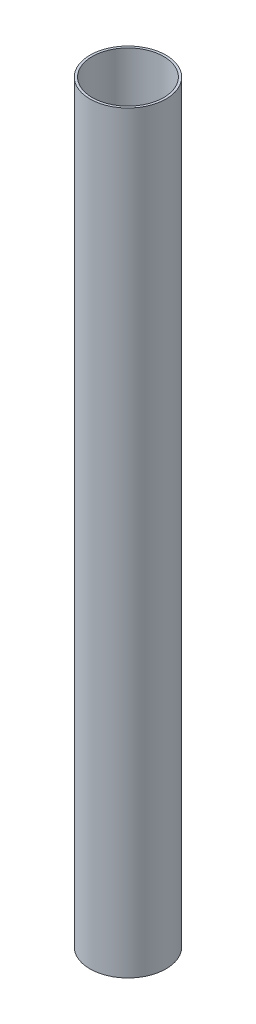
ISO-10303-21;
HEADER;
FILE_DESCRIPTION(('STEP AP214'),'2;1');
FILE_NAME('part.step','',(''),(''),'','','');
FILE_SCHEMA(('AUTOMOTIVE_DESIGN { 1 0 10303 214 1 1 1 1 }'));
ENDSEC;
DATA;
#1=APPLICATION_CONTEXT('core data for automotive mechanical design processes');
#2=APPLICATION_PROTOCOL_DEFINITION('international standard','automotive_design',2000,#1);
#3=PRODUCT_CONTEXT('',#1,'mechanical');
#4=PRODUCT('Part','Part','',(#3));
#5=PRODUCT_RELATED_PRODUCT_CATEGORY('part','',(#4));
#6=PRODUCT_DEFINITION_FORMATION('','',#4);
#7=PRODUCT_DEFINITION_CONTEXT('part definition',#1,'design');
#8=PRODUCT_DEFINITION('design','',#6,#7);
#9=PRODUCT_DEFINITION_SHAPE('','',#8);
#10=(LENGTH_UNIT() NAMED_UNIT(*) SI_UNIT(.MILLI.,.METRE.));
#11=(NAMED_UNIT(*) PLANE_ANGLE_UNIT() SI_UNIT($,.RADIAN.));
#12=(NAMED_UNIT(*) SI_UNIT($,.STERADIAN.) SOLID_ANGLE_UNIT());
#13=UNCERTAINTY_MEASURE_WITH_UNIT(LENGTH_MEASURE(1.E-05),#10,'distance_accuracy_value','');
#14=(GEOMETRIC_REPRESENTATION_CONTEXT(3) GLOBAL_UNCERTAINTY_ASSIGNED_CONTEXT((#13)) GLOBAL_UNIT_ASSIGNED_CONTEXT((#10,
#11,#12)) REPRESENTATION_CONTEXT('',''));
#15=CARTESIAN_POINT('',(0.,0.,0.));
#16=DIRECTION('',(0.,0.,1.));
#17=DIRECTION('',(1.,0.,0.));
#18=AXIS2_PLACEMENT_3D('',#15,#16,#17);
#19=CARTESIAN_POINT('',(0.,1140.,0.));
#20=DIRECTION('',(0.,1.,0.));
#21=DIRECTION('',(0.,0.,1.));
#22=AXIS2_PLACEMENT_3D('',#19,#20,#21);
#23=PLANE('',#22);
#24=CARTESIAN_POINT('',(0.,1140.,0.));
#25=DIRECTION('',(0.,1.,0.));
#26=DIRECTION('',(0.,0.,1.));
#27=AXIS2_PLACEMENT_3D('',#24,#25,#26);
#28=CIRCLE('',#27,57.5);
#29=CARTESIAN_POINT('',(0.,1140.,57.5));
#30=VERTEX_POINT('',#29);
#31=EDGE_CURVE('E10',#30,#30,#28,.T.);
#32=ORIENTED_EDGE('',*,*,#31,.T.);
#33=EDGE_LOOP('',(#32));
#34=FACE_BOUND('',#33,.T.);
#35=CARTESIAN_POINT('',(0.,1140.,0.));
#36=DIRECTION('',(0.,1.,0.));
#37=DIRECTION('',(0.,0.,1.));
#38=AXIS2_PLACEMENT_3D('',#35,#36,#37);
#39=CIRCLE('',#38,54.);
#40=CARTESIAN_POINT('',(0.,1140.,54.));
#41=VERTEX_POINT('',#40);
#42=EDGE_CURVE('E50',#41,#41,#39,.T.);
#43=ORIENTED_EDGE('',*,*,#42,.F.);
#44=EDGE_LOOP('',(#43));
#45=FACE_BOUND('',#44,.T.);
#46=ADVANCED_FACE('F37',(#34,#45),#23,.T.);
#47=CARTESIAN_POINT('',(0.,0.,0.));
#48=DIRECTION('',(0.,1.,0.));
#49=DIRECTION('',(0.,0.,1.));
#50=AXIS2_PLACEMENT_3D('',#47,#48,#49);
#51=PLANE('',#50);
#52=CARTESIAN_POINT('',(0.,0.,0.));
#53=DIRECTION('',(0.,1.,0.));
#54=DIRECTION('',(0.,0.,1.));
#55=AXIS2_PLACEMENT_3D('',#52,#53,#54);
#56=CIRCLE('',#55,57.5);
#57=CARTESIAN_POINT('',(0.,0.,57.5));
#58=VERTEX_POINT('',#57);
#59=EDGE_CURVE('E41',#58,#58,#56,.T.);
#60=ORIENTED_EDGE('',*,*,#59,.F.);
#61=EDGE_LOOP('',(#60));
#62=FACE_BOUND('',#61,.T.);
#63=CARTESIAN_POINT('',(0.,0.,0.));
#64=DIRECTION('',(0.,1.,0.));
#65=DIRECTION('',(0.,0.,1.));
#66=AXIS2_PLACEMENT_3D('',#63,#64,#65);
#67=CIRCLE('',#66,54.);
#68=CARTESIAN_POINT('',(0.,0.,54.));
#69=VERTEX_POINT('',#68);
#70=EDGE_CURVE('E52',#69,#69,#67,.T.);
#71=ORIENTED_EDGE('',*,*,#70,.T.);
#72=EDGE_LOOP('',(#71));
#73=FACE_BOUND('',#72,.T.);
#74=ADVANCED_FACE('F64',(#62,#73),#51,.F.);
#75=CARTESIAN_POINT('',(0.,1140.,0.));
#76=DIRECTION('',(0.,-1.,0.));
#77=DIRECTION('',(0.,0.,-1.));
#78=AXIS2_PLACEMENT_3D('',#75,#76,#77);
#79=CYLINDRICAL_SURFACE('',#78,57.5);
#80=ORIENTED_EDGE('',*,*,#31,.F.);
#81=EDGE_LOOP('',(#80));
#82=FACE_BOUND('',#81,.T.);
#83=ORIENTED_EDGE('',*,*,#59,.T.);
#84=EDGE_LOOP('',(#83));
#85=FACE_BOUND('',#84,.T.);
#86=ADVANCED_FACE('F39',(#82,#85),#79,.T.);
#87=CARTESIAN_POINT('',(0.,1140.,0.));
#88=DIRECTION('',(0.,-1.,0.));
#89=DIRECTION('',(0.,0.,-1.));
#90=AXIS2_PLACEMENT_3D('',#87,#88,#89);
#91=CYLINDRICAL_SURFACE('',#90,54.);
#92=ORIENTED_EDGE('',*,*,#42,.T.);
#93=EDGE_LOOP('',(#92));
#94=FACE_BOUND('',#93,.T.);
#95=ORIENTED_EDGE('',*,*,#70,.F.);
#96=EDGE_LOOP('',(#95));
#97=FACE_BOUND('',#96,.T.);
#98=ADVANCED_FACE('F60',(#94,#97),#91,.F.);
#99=CLOSED_SHELL('',(#46,#74,#86,#98));
#100=MANIFOLD_SOLID_BREP('B2',#99);
#101=ADVANCED_BREP_SHAPE_REPRESENTATION('',(#18,#100),#14);
#102=SHAPE_DEFINITION_REPRESENTATION(#9,#101);
ENDSEC;
END-ISO-10303-21;
